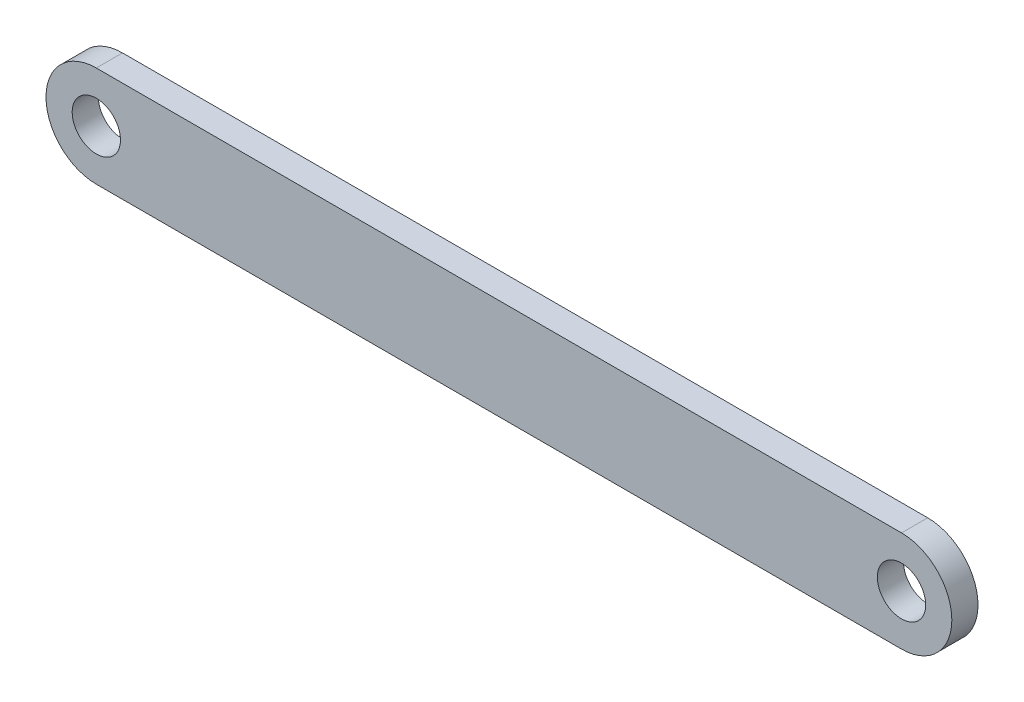
ISO-10303-21;
HEADER;
FILE_DESCRIPTION(('STEP AP214'),'2;1');
FILE_NAME('part.step','',(''),(''),'','','');
FILE_SCHEMA(('AUTOMOTIVE_DESIGN { 1 0 10303 214 1 1 1 1 }'));
ENDSEC;
DATA;
#1=APPLICATION_CONTEXT('core data for automotive mechanical design processes');
#2=APPLICATION_PROTOCOL_DEFINITION('international standard','automotive_design',2000,#1);
#3=PRODUCT_CONTEXT('',#1,'mechanical');
#4=PRODUCT('Part','Part','',(#3));
#5=PRODUCT_RELATED_PRODUCT_CATEGORY('part','',(#4));
#6=PRODUCT_DEFINITION_FORMATION('','',#4);
#7=PRODUCT_DEFINITION_CONTEXT('part definition',#1,'design');
#8=PRODUCT_DEFINITION('design','',#6,#7);
#9=PRODUCT_DEFINITION_SHAPE('','',#8);
#10=(LENGTH_UNIT() NAMED_UNIT(*) SI_UNIT(.MILLI.,.METRE.));
#11=(NAMED_UNIT(*) PLANE_ANGLE_UNIT() SI_UNIT($,.RADIAN.));
#12=(NAMED_UNIT(*) SI_UNIT($,.STERADIAN.) SOLID_ANGLE_UNIT());
#13=UNCERTAINTY_MEASURE_WITH_UNIT(LENGTH_MEASURE(1.E-05),#10,'distance_accuracy_value','');
#14=(GEOMETRIC_REPRESENTATION_CONTEXT(3) GLOBAL_UNCERTAINTY_ASSIGNED_CONTEXT((#13)) GLOBAL_UNIT_ASSIGNED_CONTEXT((#10,
#11,#12)) REPRESENTATION_CONTEXT('',''));
#15=CARTESIAN_POINT('',(0.,0.,0.));
#16=DIRECTION('',(0.,0.,1.));
#17=DIRECTION('',(1.,0.,0.));
#18=AXIS2_PLACEMENT_3D('',#15,#16,#17);
#19=CARTESIAN_POINT('',(0.,0.,3.25));
#20=DIRECTION('',(0.,0.,1.));
#21=DIRECTION('',(1.,0.,0.));
#22=AXIS2_PLACEMENT_3D('',#19,#20,#21);
#23=PLANE('',#22);
#24=CARTESIAN_POINT('',(0.,0.,3.25));
#25=DIRECTION('',(0.,0.,1.));
#26=DIRECTION('',(1.,0.,0.));
#27=AXIS2_PLACEMENT_3D('',#24,#25,#26);
#28=CIRCLE('',#27,6.);
#29=CARTESIAN_POINT('',(-5.99999999999999,0.,3.25));
#30=VERTEX_POINT('',#29);
#31=EDGE_CURVE('E109',#30,#30,#28,.T.);
#32=ORIENTED_EDGE('',*,*,#31,.F.);
#33=EDGE_LOOP('',(#32));
#34=FACE_BOUND('',#33,.T.);
#35=CARTESIAN_POINT('',(0.,0.,3.25));
#36=DIRECTION('',(0.,0.,1.));
#37=DIRECTION('',(1.,0.,0.));
#38=AXIS2_PLACEMENT_3D('',#35,#36,#37);
#39=CIRCLE('',#38,12.5);
#40=CARTESIAN_POINT('',(0.,12.5,3.25));
#41=VERTEX_POINT('',#40);
#42=CARTESIAN_POINT('',(0.,-12.5,3.25));
#43=VERTEX_POINT('',#42);
#44=EDGE_CURVE('E89',#41,#43,#39,.T.);
#45=ORIENTED_EDGE('',*,*,#44,.T.);
#46=DIRECTION('',(1.,0.,0.));
#47=VECTOR('',#46,1.);
#48=CARTESIAN_POINT('',(0.,-12.5,3.25));
#49=LINE('',#48,#47);
#50=CARTESIAN_POINT('',(200.,-12.5,3.25));
#51=VERTEX_POINT('',#50);
#52=EDGE_CURVE('E84',#43,#51,#49,.T.);
#53=ORIENTED_EDGE('',*,*,#52,.T.);
#54=CARTESIAN_POINT('',(200.,0.,3.25));
#55=DIRECTION('',(0.,0.,1.));
#56=DIRECTION('',(1.,0.,0.));
#57=AXIS2_PLACEMENT_3D('',#54,#55,#56);
#58=CIRCLE('',#57,12.5);
#59=CARTESIAN_POINT('',(200.,12.5,3.25));
#60=VERTEX_POINT('',#59);
#61=EDGE_CURVE('E87',#51,#60,#58,.T.);
#62=ORIENTED_EDGE('',*,*,#61,.T.);
#63=DIRECTION('',(-1.,0.,0.));
#64=VECTOR('',#63,1.);
#65=CARTESIAN_POINT('',(0.,12.5,3.25));
#66=LINE('',#65,#64);
#67=EDGE_CURVE('E54',#60,#41,#66,.T.);
#68=ORIENTED_EDGE('',*,*,#67,.T.);
#69=EDGE_LOOP('',(#45,#53,#62,#68));
#70=FACE_BOUND('',#69,.T.);
#71=CARTESIAN_POINT('',(200.,0.,3.25));
#72=DIRECTION('',(0.,0.,1.));
#73=DIRECTION('',(1.,0.,0.));
#74=AXIS2_PLACEMENT_3D('',#71,#72,#73);
#75=CIRCLE('',#74,6.00000000000002);
#76=CARTESIAN_POINT('',(194.,0.,3.25));
#77=VERTEX_POINT('',#76);
#78=EDGE_CURVE('E131',#77,#77,#75,.T.);
#79=ORIENTED_EDGE('',*,*,#78,.F.);
#80=EDGE_LOOP('',(#79));
#81=FACE_BOUND('',#80,.T.);
#82=ADVANCED_FACE('F36',(#34,#70,#81),#23,.T.);
#83=CARTESIAN_POINT('',(0.,0.,-3.25));
#84=DIRECTION('',(0.,0.,1.));
#85=DIRECTION('',(1.,0.,0.));
#86=AXIS2_PLACEMENT_3D('',#83,#84,#85);
#87=PLANE('',#86);
#88=CARTESIAN_POINT('',(0.,0.,-3.25));
#89=DIRECTION('',(0.,0.,1.));
#90=DIRECTION('',(1.,0.,0.));
#91=AXIS2_PLACEMENT_3D('',#88,#89,#90);
#92=CIRCLE('',#91,12.5);
#93=CARTESIAN_POINT('',(0.,12.5,-3.25));
#94=VERTEX_POINT('',#93);
#95=CARTESIAN_POINT('',(0.,-12.5,-3.25));
#96=VERTEX_POINT('',#95);
#97=EDGE_CURVE('E105',#94,#96,#92,.T.);
#98=ORIENTED_EDGE('',*,*,#97,.F.);
#99=DIRECTION('',(-1.,0.,0.));
#100=VECTOR('',#99,1.);
#101=CARTESIAN_POINT('',(0.,12.5,-3.25));
#102=LINE('',#101,#100);
#103=CARTESIAN_POINT('',(200.,12.5,-3.25));
#104=VERTEX_POINT('',#103);
#105=EDGE_CURVE('E77',#104,#94,#102,.T.);
#106=ORIENTED_EDGE('',*,*,#105,.F.);
#107=CARTESIAN_POINT('',(200.,0.,-3.25));
#108=DIRECTION('',(0.,0.,1.));
#109=DIRECTION('',(1.,0.,0.));
#110=AXIS2_PLACEMENT_3D('',#107,#108,#109);
#111=CIRCLE('',#110,12.5);
#112=CARTESIAN_POINT('',(200.,-12.5,-3.25));
#113=VERTEX_POINT('',#112);
#114=EDGE_CURVE('E71',#113,#104,#111,.T.);
#115=ORIENTED_EDGE('',*,*,#114,.F.);
#116=DIRECTION('',(1.,0.,0.));
#117=VECTOR('',#116,1.);
#118=CARTESIAN_POINT('',(0.,-12.5,-3.25));
#119=LINE('',#118,#117);
#120=EDGE_CURVE('E94',#96,#113,#119,.T.);
#121=ORIENTED_EDGE('',*,*,#120,.F.);
#122=EDGE_LOOP('',(#98,#106,#115,#121));
#123=FACE_BOUND('',#122,.T.);
#124=CARTESIAN_POINT('',(0.,0.,-3.25));
#125=DIRECTION('',(0.,0.,1.));
#126=DIRECTION('',(1.,0.,0.));
#127=AXIS2_PLACEMENT_3D('',#124,#125,#126);
#128=CIRCLE('',#127,6.);
#129=CARTESIAN_POINT('',(-5.99999999999999,0.,-3.25));
#130=VERTEX_POINT('',#129);
#131=EDGE_CURVE('E128',#130,#130,#128,.T.);
#132=ORIENTED_EDGE('',*,*,#131,.T.);
#133=EDGE_LOOP('',(#132));
#134=FACE_BOUND('',#133,.T.);
#135=CARTESIAN_POINT('',(200.,0.,-3.25));
#136=DIRECTION('',(0.,0.,1.));
#137=DIRECTION('',(1.,0.,0.));
#138=AXIS2_PLACEMENT_3D('',#135,#136,#137);
#139=CIRCLE('',#138,6.00000000000002);
#140=CARTESIAN_POINT('',(194.,0.,-3.25));
#141=VERTEX_POINT('',#140);
#142=EDGE_CURVE('E135',#141,#141,#139,.T.);
#143=ORIENTED_EDGE('',*,*,#142,.T.);
#144=EDGE_LOOP('',(#143));
#145=FACE_BOUND('',#144,.T.);
#146=ADVANCED_FACE('F124',(#123,#134,#145),#87,.F.);
#147=CARTESIAN_POINT('',(0.,0.,3.25));
#148=DIRECTION('',(0.,0.,-1.));
#149=DIRECTION('',(-1.,0.,0.));
#150=AXIS2_PLACEMENT_3D('',#147,#148,#149);
#151=CYLINDRICAL_SURFACE('',#150,12.5);
#152=ORIENTED_EDGE('',*,*,#97,.T.);
#153=DIRECTION('',(0.,0.,-1.));
#154=VECTOR('',#153,1.);
#155=CARTESIAN_POINT('',(0.,-12.5,3.25));
#156=LINE('',#155,#154);
#157=EDGE_CURVE('E11',#43,#96,#156,.T.);
#158=ORIENTED_EDGE('',*,*,#157,.F.);
#159=ORIENTED_EDGE('',*,*,#44,.F.);
#160=DIRECTION('',(0.,0.,-1.));
#161=VECTOR('',#160,1.);
#162=CARTESIAN_POINT('',(0.,12.5,3.25));
#163=LINE('',#162,#161);
#164=EDGE_CURVE('E101',#41,#94,#163,.T.);
#165=ORIENTED_EDGE('',*,*,#164,.T.);
#166=EDGE_LOOP('',(#152,#158,#159,#165));
#167=FACE_BOUND('',#166,.T.);
#168=ADVANCED_FACE('F38',(#167),#151,.T.);
#169=CARTESIAN_POINT('',(0.,-12.5,3.25));
#170=DIRECTION('',(0.,1.,0.));
#171=DIRECTION('',(0.,0.,1.));
#172=AXIS2_PLACEMENT_3D('',#169,#170,#171);
#173=PLANE('',#172);
#174=ORIENTED_EDGE('',*,*,#120,.T.);
#175=DIRECTION('',(0.,0.,-1.));
#176=VECTOR('',#175,1.);
#177=CARTESIAN_POINT('',(200.,-12.5,3.25));
#178=LINE('',#177,#176);
#179=EDGE_CURVE('E46',#51,#113,#178,.T.);
#180=ORIENTED_EDGE('',*,*,#179,.F.);
#181=ORIENTED_EDGE('',*,*,#52,.F.);
#182=ORIENTED_EDGE('',*,*,#157,.T.);
#183=EDGE_LOOP('',(#174,#180,#181,#182));
#184=FACE_BOUND('',#183,.T.);
#185=ADVANCED_FACE('F93',(#184),#173,.F.);
#186=CARTESIAN_POINT('',(200.,0.,3.25));
#187=DIRECTION('',(0.,0.,-1.));
#188=DIRECTION('',(-1.,0.,0.));
#189=AXIS2_PLACEMENT_3D('',#186,#187,#188);
#190=CYLINDRICAL_SURFACE('',#189,12.5);
#191=ORIENTED_EDGE('',*,*,#114,.T.);
#192=DIRECTION('',(0.,0.,-1.));
#193=VECTOR('',#192,1.);
#194=CARTESIAN_POINT('',(200.,12.5,3.25));
#195=LINE('',#194,#193);
#196=EDGE_CURVE('E96',#60,#104,#195,.T.);
#197=ORIENTED_EDGE('',*,*,#196,.F.);
#198=ORIENTED_EDGE('',*,*,#61,.F.);
#199=ORIENTED_EDGE('',*,*,#179,.T.);
#200=EDGE_LOOP('',(#191,#197,#198,#199));
#201=FACE_BOUND('',#200,.T.);
#202=ADVANCED_FACE('F97',(#201),#190,.T.);
#203=CARTESIAN_POINT('',(0.,12.5,3.25));
#204=DIRECTION('',(0.,-1.,0.));
#205=DIRECTION('',(0.,0.,-1.));
#206=AXIS2_PLACEMENT_3D('',#203,#204,#205);
#207=PLANE('',#206);
#208=ORIENTED_EDGE('',*,*,#105,.T.);
#209=ORIENTED_EDGE('',*,*,#164,.F.);
#210=ORIENTED_EDGE('',*,*,#67,.F.);
#211=ORIENTED_EDGE('',*,*,#196,.T.);
#212=EDGE_LOOP('',(#208,#209,#210,#211));
#213=FACE_BOUND('',#212,.T.);
#214=ADVANCED_FACE('F121',(#213),#207,.F.);
#215=CARTESIAN_POINT('',(0.,0.,3.25));
#216=DIRECTION('',(0.,0.,-1.));
#217=DIRECTION('',(-1.,0.,0.));
#218=AXIS2_PLACEMENT_3D('',#215,#216,#217);
#219=CYLINDRICAL_SURFACE('',#218,6.);
#220=CARTESIAN_POINT('',(-5.99999999999999,0.,3.25));
#221=CARTESIAN_POINT('',(-5.99999999999999,0.,3.18229166666667));
#222=CARTESIAN_POINT('',(-5.99999999999999,0.,3.11458333333333));
#223=CARTESIAN_POINT('',(-5.99999999999999,0.,2.97916666666667));
#224=CARTESIAN_POINT('',(-5.99999999999999,0.,2.91145833333333));
#225=CARTESIAN_POINT('',(-5.99999999999999,0.,2.77604166666667));
#226=CARTESIAN_POINT('',(-5.99999999999999,0.,2.70833333333333));
#227=CARTESIAN_POINT('',(-5.99999999999999,0.,2.57291666666667));
#228=CARTESIAN_POINT('',(-5.99999999999999,0.,2.50520833333333));
#229=CARTESIAN_POINT('',(-5.99999999999999,0.,2.36979166666667));
#230=CARTESIAN_POINT('',(-5.99999999999999,0.,2.30208333333333));
#231=CARTESIAN_POINT('',(-5.99999999999999,0.,2.16666666666667));
#232=CARTESIAN_POINT('',(-5.99999999999999,0.,2.09895833333333));
#233=CARTESIAN_POINT('',(-5.99999999999999,0.,1.96354166666667));
#234=CARTESIAN_POINT('',(-5.99999999999999,0.,1.89583333333333));
#235=CARTESIAN_POINT('',(-5.99999999999999,0.,1.76041666666667));
#236=CARTESIAN_POINT('',(-5.99999999999999,0.,1.69270833333333));
#237=CARTESIAN_POINT('',(-5.99999999999999,0.,1.55729166666667));
#238=CARTESIAN_POINT('',(-5.99999999999999,0.,1.48958333333333));
#239=CARTESIAN_POINT('',(-5.99999999999999,0.,1.35416666666667));
#240=CARTESIAN_POINT('',(-5.99999999999999,0.,1.28645833333333));
#241=CARTESIAN_POINT('',(-5.99999999999999,0.,1.15104166666667));
#242=CARTESIAN_POINT('',(-5.99999999999999,0.,1.08333333333333));
#243=CARTESIAN_POINT('',(-5.99999999999999,0.,0.947916666666667));
#244=CARTESIAN_POINT('',(-5.99999999999999,0.,0.880208333333333));
#245=CARTESIAN_POINT('',(-5.99999999999999,0.,0.744791666666667));
#246=CARTESIAN_POINT('',(-5.99999999999999,0.,0.677083333333333));
#247=CARTESIAN_POINT('',(-5.99999999999999,0.,0.541666666666667));
#248=CARTESIAN_POINT('',(-5.99999999999999,0.,0.473958333333333));
#249=CARTESIAN_POINT('',(-5.99999999999999,0.,0.338541666666667));
#250=CARTESIAN_POINT('',(-5.99999999999999,0.,0.270833333333333));
#251=CARTESIAN_POINT('',(-5.99999999999999,0.,0.135416666666667));
#252=CARTESIAN_POINT('',(-5.99999999999999,0.,0.0677083333333334));
#253=CARTESIAN_POINT('',(-5.99999999999999,0.,-0.0677083333333334));
#254=CARTESIAN_POINT('',(-5.99999999999999,0.,-0.135416666666667));
#255=CARTESIAN_POINT('',(-5.99999999999999,0.,-0.270833333333333));
#256=CARTESIAN_POINT('',(-5.99999999999999,0.,-0.338541666666667));
#257=CARTESIAN_POINT('',(-5.99999999999999,0.,-0.473958333333333));
#258=CARTESIAN_POINT('',(-5.99999999999999,0.,-0.541666666666667));
#259=CARTESIAN_POINT('',(-5.99999999999999,0.,-0.677083333333333));
#260=CARTESIAN_POINT('',(-5.99999999999999,0.,-0.744791666666666));
#261=CARTESIAN_POINT('',(-5.99999999999999,0.,-0.880208333333333));
#262=CARTESIAN_POINT('',(-5.99999999999999,0.,-0.947916666666666));
#263=CARTESIAN_POINT('',(-5.99999999999999,0.,-1.08333333333333));
#264=CARTESIAN_POINT('',(-5.99999999999999,0.,-1.15104166666667));
#265=CARTESIAN_POINT('',(-5.99999999999999,0.,-1.28645833333333));
#266=CARTESIAN_POINT('',(-5.99999999999999,0.,-1.35416666666667));
#267=CARTESIAN_POINT('',(-5.99999999999999,0.,-1.48958333333333));
#268=CARTESIAN_POINT('',(-5.99999999999999,0.,-1.55729166666667));
#269=CARTESIAN_POINT('',(-5.99999999999999,0.,-1.69270833333333));
#270=CARTESIAN_POINT('',(-5.99999999999999,0.,-1.76041666666667));
#271=CARTESIAN_POINT('',(-5.99999999999999,0.,-1.89583333333333));
#272=CARTESIAN_POINT('',(-5.99999999999999,0.,-1.96354166666667));
#273=CARTESIAN_POINT('',(-5.99999999999999,0.,-2.09895833333333));
#274=CARTESIAN_POINT('',(-5.99999999999999,0.,-2.16666666666667));
#275=CARTESIAN_POINT('',(-5.99999999999999,0.,-2.30208333333333));
#276=CARTESIAN_POINT('',(-5.99999999999999,0.,-2.36979166666667));
#277=CARTESIAN_POINT('',(-5.99999999999999,0.,-2.50520833333333));
#278=CARTESIAN_POINT('',(-5.99999999999999,0.,-2.57291666666667));
#279=CARTESIAN_POINT('',(-5.99999999999999,0.,-2.70833333333333));
#280=CARTESIAN_POINT('',(-5.99999999999999,0.,-2.77604166666667));
#281=CARTESIAN_POINT('',(-5.99999999999999,0.,-2.91145833333333));
#282=CARTESIAN_POINT('',(-5.99999999999999,0.,-2.97916666666667));
#283=CARTESIAN_POINT('',(-5.99999999999999,0.,-3.11458333333333));
#284=CARTESIAN_POINT('',(-5.99999999999999,0.,-3.18229166666667));
#285=CARTESIAN_POINT('',(-5.99999999999999,0.,-3.25));
#286=B_SPLINE_CURVE_WITH_KNOTS('',3,(#220,#221,#222,#223,#224,#225,#226,#227,#228,#229,#230,
#231,#232,#233,#234,#235,#236,#237,#238,#239,#240,#241,#242,#243,#244,#245,#246,#247,#248,#249,
#250,#251,#252,#253,#254,#255,#256,#257,#258,#259,#260,#261,#262,#263,#264,#265,#266,#267,#268,
#269,#270,#271,#272,#273,#274,#275,#276,#277,#278,#279,#280,#281,#282,#283,#284,#285),
.UNSPECIFIED.,.F.,.F.,(4,2,2,2,2,2,2,2,2,2,2,2,2,2,2,2,2,2,2,2,2,2,2,2,2,2,2,2,2,2,2,2,4),(0.,
0.203125,0.40625,0.609375,0.8125,1.015625,1.21875,1.421875,1.625,1.828125,2.03125,2.234375,
2.4375,2.640625,2.84375,3.046875,3.25,3.453125,3.65625,3.859375,4.0625,4.265625,4.46875,
4.671875,4.875,5.078125,5.28125,5.484375,5.6875,5.890625,6.09375,6.296875,6.5),.UNSPECIFIED.);
#287=EDGE_CURVE('BSEAM154',#30,#130,#286,.T.);
#288=ORIENTED_EDGE('',*,*,#31,.T.);
#289=ORIENTED_EDGE('',*,*,#131,.F.);
#290=ORIENTED_EDGE('',*,*,#287,.T.);
#291=ORIENTED_EDGE('',*,*,#287,.F.);
#292=EDGE_LOOP('',(#288,#290,#289,#291));
#293=FACE_BOUND('',#292,.T.);
#294=ADVANCED_FACE('F154',(#293),#219,.F.);
#295=CARTESIAN_POINT('',(200.,0.,3.25));
#296=DIRECTION('',(0.,0.,-1.));
#297=DIRECTION('',(-1.,0.,0.));
#298=AXIS2_PLACEMENT_3D('',#295,#296,#297);
#299=CYLINDRICAL_SURFACE('',#298,6.00000000000002);
#300=CARTESIAN_POINT('',(194.,0.,3.25));
#301=CARTESIAN_POINT('',(194.,0.,3.18229166666667));
#302=CARTESIAN_POINT('',(194.,0.,3.11458333333333));
#303=CARTESIAN_POINT('',(194.,0.,2.97916666666667));
#304=CARTESIAN_POINT('',(194.,0.,2.91145833333333));
#305=CARTESIAN_POINT('',(194.,0.,2.77604166666667));
#306=CARTESIAN_POINT('',(194.,0.,2.70833333333333));
#307=CARTESIAN_POINT('',(194.,0.,2.57291666666667));
#308=CARTESIAN_POINT('',(194.,0.,2.50520833333333));
#309=CARTESIAN_POINT('',(194.,0.,2.36979166666667));
#310=CARTESIAN_POINT('',(194.,0.,2.30208333333333));
#311=CARTESIAN_POINT('',(194.,0.,2.16666666666667));
#312=CARTESIAN_POINT('',(194.,0.,2.09895833333333));
#313=CARTESIAN_POINT('',(194.,0.,1.96354166666667));
#314=CARTESIAN_POINT('',(194.,0.,1.89583333333333));
#315=CARTESIAN_POINT('',(194.,0.,1.76041666666667));
#316=CARTESIAN_POINT('',(194.,0.,1.69270833333333));
#317=CARTESIAN_POINT('',(194.,0.,1.55729166666667));
#318=CARTESIAN_POINT('',(194.,0.,1.48958333333333));
#319=CARTESIAN_POINT('',(194.,0.,1.35416666666667));
#320=CARTESIAN_POINT('',(194.,0.,1.28645833333333));
#321=CARTESIAN_POINT('',(194.,0.,1.15104166666667));
#322=CARTESIAN_POINT('',(194.,0.,1.08333333333333));
#323=CARTESIAN_POINT('',(194.,0.,0.947916666666667));
#324=CARTESIAN_POINT('',(194.,0.,0.880208333333333));
#325=CARTESIAN_POINT('',(194.,0.,0.744791666666667));
#326=CARTESIAN_POINT('',(194.,0.,0.677083333333333));
#327=CARTESIAN_POINT('',(194.,0.,0.541666666666667));
#328=CARTESIAN_POINT('',(194.,0.,0.473958333333333));
#329=CARTESIAN_POINT('',(194.,0.,0.338541666666667));
#330=CARTESIAN_POINT('',(194.,0.,0.270833333333333));
#331=CARTESIAN_POINT('',(194.,0.,0.135416666666667));
#332=CARTESIAN_POINT('',(194.,0.,0.0677083333333334));
#333=CARTESIAN_POINT('',(194.,0.,-0.0677083333333334));
#334=CARTESIAN_POINT('',(194.,0.,-0.135416666666667));
#335=CARTESIAN_POINT('',(194.,0.,-0.270833333333333));
#336=CARTESIAN_POINT('',(194.,0.,-0.338541666666667));
#337=CARTESIAN_POINT('',(194.,0.,-0.473958333333333));
#338=CARTESIAN_POINT('',(194.,0.,-0.541666666666667));
#339=CARTESIAN_POINT('',(194.,0.,-0.677083333333333));
#340=CARTESIAN_POINT('',(194.,0.,-0.744791666666666));
#341=CARTESIAN_POINT('',(194.,0.,-0.880208333333333));
#342=CARTESIAN_POINT('',(194.,0.,-0.947916666666666));
#343=CARTESIAN_POINT('',(194.,0.,-1.08333333333333));
#344=CARTESIAN_POINT('',(194.,0.,-1.15104166666667));
#345=CARTESIAN_POINT('',(194.,0.,-1.28645833333333));
#346=CARTESIAN_POINT('',(194.,0.,-1.35416666666667));
#347=CARTESIAN_POINT('',(194.,0.,-1.48958333333333));
#348=CARTESIAN_POINT('',(194.,0.,-1.55729166666667));
#349=CARTESIAN_POINT('',(194.,0.,-1.69270833333333));
#350=CARTESIAN_POINT('',(194.,0.,-1.76041666666667));
#351=CARTESIAN_POINT('',(194.,0.,-1.89583333333333));
#352=CARTESIAN_POINT('',(194.,0.,-1.96354166666667));
#353=CARTESIAN_POINT('',(194.,0.,-2.09895833333333));
#354=CARTESIAN_POINT('',(194.,0.,-2.16666666666667));
#355=CARTESIAN_POINT('',(194.,0.,-2.30208333333333));
#356=CARTESIAN_POINT('',(194.,0.,-2.36979166666667));
#357=CARTESIAN_POINT('',(194.,0.,-2.50520833333333));
#358=CARTESIAN_POINT('',(194.,0.,-2.57291666666667));
#359=CARTESIAN_POINT('',(194.,0.,-2.70833333333333));
#360=CARTESIAN_POINT('',(194.,0.,-2.77604166666667));
#361=CARTESIAN_POINT('',(194.,0.,-2.91145833333333));
#362=CARTESIAN_POINT('',(194.,0.,-2.97916666666667));
#363=CARTESIAN_POINT('',(194.,0.,-3.11458333333333));
#364=CARTESIAN_POINT('',(194.,0.,-3.18229166666667));
#365=CARTESIAN_POINT('',(194.,0.,-3.25));
#366=B_SPLINE_CURVE_WITH_KNOTS('',3,(#300,#301,#302,#303,#304,#305,#306,#307,#308,#309,#310,
#311,#312,#313,#314,#315,#316,#317,#318,#319,#320,#321,#322,#323,#324,#325,#326,#327,#328,#329,
#330,#331,#332,#333,#334,#335,#336,#337,#338,#339,#340,#341,#342,#343,#344,#345,#346,#347,#348,
#349,#350,#351,#352,#353,#354,#355,#356,#357,#358,#359,#360,#361,#362,#363,#364,#365),
.UNSPECIFIED.,.F.,.F.,(4,2,2,2,2,2,2,2,2,2,2,2,2,2,2,2,2,2,2,2,2,2,2,2,2,2,2,2,2,2,2,2,4),(0.,
0.203125,0.40625,0.609375,0.8125,1.015625,1.21875,1.421875,1.625,1.828125,2.03125,2.234375,
2.4375,2.640625,2.84375,3.046875,3.25,3.453125,3.65625,3.859375,4.0625,4.265625,4.46875,
4.671875,4.875,5.078125,5.28125,5.484375,5.6875,5.890625,6.09375,6.296875,6.5),.UNSPECIFIED.);
#367=EDGE_CURVE('BSEAM143',#77,#141,#366,.T.);
#368=ORIENTED_EDGE('',*,*,#78,.T.);
#369=ORIENTED_EDGE('',*,*,#142,.F.);
#370=ORIENTED_EDGE('',*,*,#367,.T.);
#371=ORIENTED_EDGE('',*,*,#367,.F.);
#372=EDGE_LOOP('',(#368,#370,#369,#371));
#373=FACE_BOUND('',#372,.T.);
#374=ADVANCED_FACE('F143',(#373),#299,.F.);
#375=CLOSED_SHELL('',(#82,#146,#168,#185,#202,#214,#294,#374));
#376=MANIFOLD_SOLID_BREP('B2',#375);
#377=ADVANCED_BREP_SHAPE_REPRESENTATION('',(#18,#376),#14);
#378=SHAPE_DEFINITION_REPRESENTATION(#9,#377);
ENDSEC;
END-ISO-10303-21;
